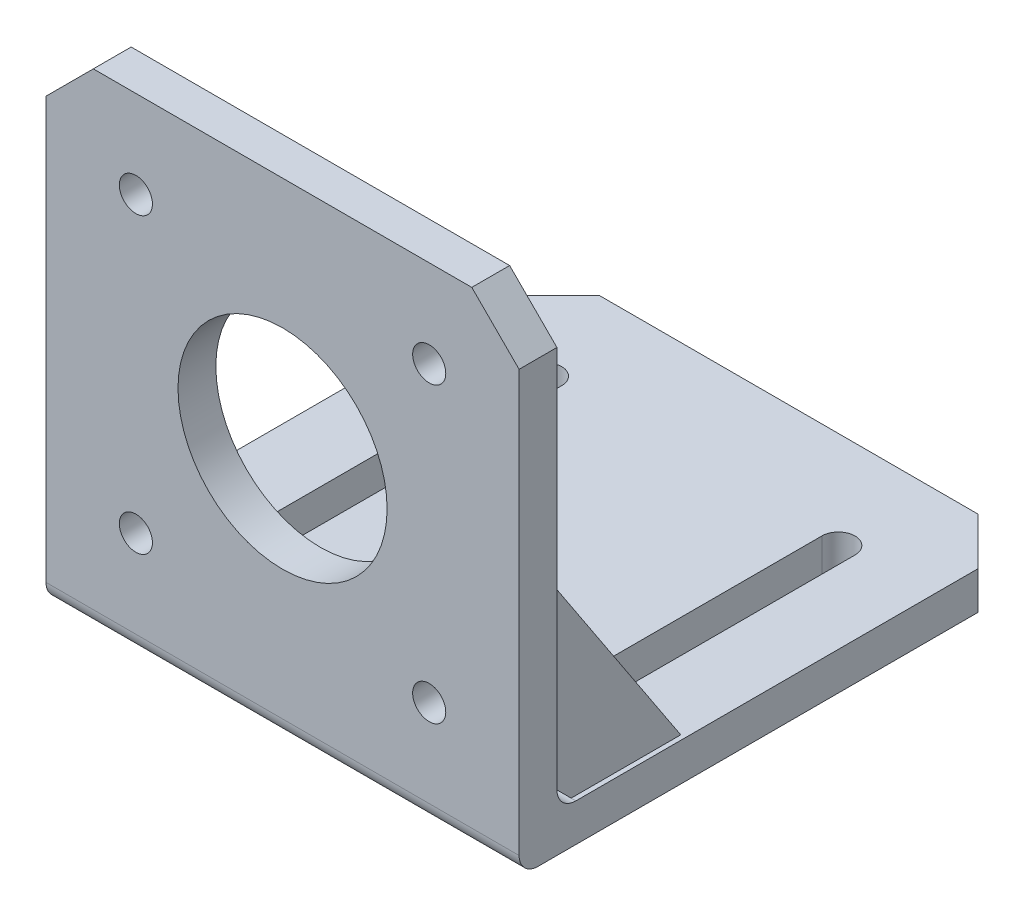
ISO-10303-21;
HEADER;
FILE_DESCRIPTION(('STEP AP214'),'2;1');
FILE_NAME('part.step','',(''),(''),'','','');
FILE_SCHEMA(('AUTOMOTIVE_DESIGN { 1 0 10303 214 1 1 1 1 }'));
ENDSEC;
DATA;
#1=APPLICATION_CONTEXT('core data for automotive mechanical design processes');
#2=APPLICATION_PROTOCOL_DEFINITION('international standard','automotive_design',2000,#1);
#3=PRODUCT_CONTEXT('',#1,'mechanical');
#4=PRODUCT('Part','Part','',(#3));
#5=PRODUCT_RELATED_PRODUCT_CATEGORY('part','',(#4));
#6=PRODUCT_DEFINITION_FORMATION('','',#4);
#7=PRODUCT_DEFINITION_CONTEXT('part definition',#1,'design');
#8=PRODUCT_DEFINITION('design','',#6,#7);
#9=PRODUCT_DEFINITION_SHAPE('','',#8);
#10=(LENGTH_UNIT() NAMED_UNIT(*) SI_UNIT(.MILLI.,.METRE.));
#11=(NAMED_UNIT(*) PLANE_ANGLE_UNIT() SI_UNIT($,.RADIAN.));
#12=(NAMED_UNIT(*) SI_UNIT($,.STERADIAN.) SOLID_ANGLE_UNIT());
#13=UNCERTAINTY_MEASURE_WITH_UNIT(LENGTH_MEASURE(1.E-05),#10,'distance_accuracy_value','');
#14=(GEOMETRIC_REPRESENTATION_CONTEXT(3) GLOBAL_UNCERTAINTY_ASSIGNED_CONTEXT((#13)) GLOBAL_UNIT_ASSIGNED_CONTEXT((#10,
#11,#12)) REPRESENTATION_CONTEXT('',''));
#15=CARTESIAN_POINT('',(0.,0.,0.));
#16=DIRECTION('',(0.,0.,1.));
#17=DIRECTION('',(1.,0.,0.));
#18=AXIS2_PLACEMENT_3D('',#15,#16,#17);
#19=CARTESIAN_POINT('',(50.,4.,-6.00000000000001));
#20=DIRECTION('',(0.,-1.,0.));
#21=DIRECTION('',(0.,0.,-1.));
#22=AXIS2_PLACEMENT_3D('',#19,#20,#21);
#23=PLANE('',#22);
#24=DIRECTION('',(0.,0.,1.));
#25=VECTOR('',#24,1.);
#26=CARTESIAN_POINT('',(11.25,4.,-6.00000000000002));
#27=LINE('',#26,#25);
#28=CARTESIAN_POINT('',(11.25,4.,-43.25));
#29=VERTEX_POINT('',#28);
#30=CARTESIAN_POINT('',(11.25,4.,-12.25));
#31=VERTEX_POINT('',#30);
#32=EDGE_CURVE('E419',#29,#31,#27,.T.);
#33=ORIENTED_EDGE('',*,*,#32,.T.);
#34=CARTESIAN_POINT('',(9.5,4.,-12.25));
#35=DIRECTION('',(0.,-1.,0.));
#36=DIRECTION('',(0.,0.,-1.));
#37=AXIS2_PLACEMENT_3D('',#34,#35,#36);
#38=CIRCLE('',#37,1.75);
#39=CARTESIAN_POINT('',(7.75,4.,-12.25));
#40=VERTEX_POINT('',#39);
#41=EDGE_CURVE('E416',#31,#40,#38,.T.);
#42=ORIENTED_EDGE('',*,*,#41,.T.);
#43=DIRECTION('',(0.,0.,-1.));
#44=VECTOR('',#43,1.);
#45=CARTESIAN_POINT('',(7.75,4.,-6.00000000000002));
#46=LINE('',#45,#44);
#47=CARTESIAN_POINT('',(7.75000000000001,4.,-43.25));
#48=VERTEX_POINT('',#47);
#49=EDGE_CURVE('E425',#40,#48,#46,.T.);
#50=ORIENTED_EDGE('',*,*,#49,.T.);
#51=CARTESIAN_POINT('',(9.50000000000001,4.,-43.25));
#52=DIRECTION('',(0.,-1.,0.));
#53=DIRECTION('',(0.,0.,-1.));
#54=AXIS2_PLACEMENT_3D('',#51,#52,#53);
#55=CIRCLE('',#54,1.75);
#56=EDGE_CURVE('E422',#48,#29,#55,.T.);
#57=ORIENTED_EDGE('',*,*,#56,.T.);
#58=EDGE_LOOP('',(#33,#42,#50,#57));
#59=FACE_BOUND('',#58,.T.);
#60=DIRECTION('',(0.,0.,1.));
#61=VECTOR('',#60,1.);
#62=CARTESIAN_POINT('',(42.25,4.,-6.00000000000001));
#63=LINE('',#62,#61);
#64=CARTESIAN_POINT('',(42.25,4.,-43.25));
#65=VERTEX_POINT('',#64);
#66=CARTESIAN_POINT('',(42.25,4.,-12.25));
#67=VERTEX_POINT('',#66);
#68=EDGE_CURVE('E451',#65,#67,#63,.T.);
#69=ORIENTED_EDGE('',*,*,#68,.T.);
#70=CARTESIAN_POINT('',(40.5,4.,-12.25));
#71=DIRECTION('',(0.,-1.,0.));
#72=DIRECTION('',(0.,0.,-1.));
#73=AXIS2_PLACEMENT_3D('',#70,#71,#72);
#74=CIRCLE('',#73,1.75);
#75=CARTESIAN_POINT('',(38.75,4.,-12.25));
#76=VERTEX_POINT('',#75);
#77=EDGE_CURVE('E448',#67,#76,#74,.T.);
#78=ORIENTED_EDGE('',*,*,#77,.T.);
#79=DIRECTION('',(0.,0.,-1.));
#80=VECTOR('',#79,1.);
#81=CARTESIAN_POINT('',(38.75,4.,-6.00000000000001));
#82=LINE('',#81,#80);
#83=CARTESIAN_POINT('',(38.75,4.,-43.25));
#84=VERTEX_POINT('',#83);
#85=EDGE_CURVE('E457',#76,#84,#82,.T.);
#86=ORIENTED_EDGE('',*,*,#85,.T.);
#87=CARTESIAN_POINT('',(40.5,4.,-43.25));
#88=DIRECTION('',(0.,-1.,0.));
#89=DIRECTION('',(0.,0.,-1.));
#90=AXIS2_PLACEMENT_3D('',#87,#88,#89);
#91=CIRCLE('',#90,1.75);
#92=EDGE_CURVE('E454',#84,#65,#91,.T.);
#93=ORIENTED_EDGE('',*,*,#92,.T.);
#94=EDGE_LOOP('',(#69,#78,#86,#93));
#95=FACE_BOUND('',#94,.T.);
#96=DIRECTION('',(0.,0.,1.));
#97=VECTOR('',#96,1.);
#98=CARTESIAN_POINT('',(2.5,4.,-6.00000000000001));
#99=LINE('',#98,#97);
#100=CARTESIAN_POINT('',(2.5,4.,-17.5857864376269));
#101=VERTEX_POINT('',#100);
#102=CARTESIAN_POINT('',(2.5,4.,-6.00000000000001));
#103=VERTEX_POINT('',#102);
#104=EDGE_CURVE('E230',#101,#103,#99,.T.);
#105=ORIENTED_EDGE('',*,*,#104,.T.);
#106=DIRECTION('',(-1.,0.,0.));
#107=VECTOR('',#106,1.);
#108=CARTESIAN_POINT('',(50.,4.,-6.00000000000001));
#109=LINE('',#108,#107);
#110=CARTESIAN_POINT('',(47.5,4.,-6.00000000000001));
#111=VERTEX_POINT('',#110);
#112=EDGE_CURVE('E239',#111,#103,#109,.T.);
#113=ORIENTED_EDGE('',*,*,#112,.F.);
#114=DIRECTION('',(0.,0.,-1.));
#115=VECTOR('',#114,1.);
#116=CARTESIAN_POINT('',(47.5,4.,-6.00000000000001));
#117=LINE('',#116,#115);
#118=CARTESIAN_POINT('',(47.5,4.,-17.5857864376269));
#119=VERTEX_POINT('',#118);
#120=EDGE_CURVE('E485',#111,#119,#117,.T.);
#121=ORIENTED_EDGE('',*,*,#120,.T.);
#122=DIRECTION('',(1.,0.,0.));
#123=VECTOR('',#122,1.);
#124=CARTESIAN_POINT('',(47.5,4.,-17.5857864376269));
#125=LINE('',#124,#123);
#126=CARTESIAN_POINT('',(49.5,4.,-17.5857864376269));
#127=VERTEX_POINT('',#126);
#128=EDGE_CURVE('E480',#119,#127,#125,.T.);
#129=ORIENTED_EDGE('',*,*,#128,.T.);
#130=DIRECTION('',(0.,0.,-1.));
#131=VECTOR('',#130,1.);
#132=CARTESIAN_POINT('',(49.5,4.,-6.00000000000001));
#133=LINE('',#132,#131);
#134=CARTESIAN_POINT('',(49.5,4.,-6.00000000000001));
#135=VERTEX_POINT('',#134);
#136=EDGE_CURVE('E491',#135,#127,#133,.T.);
#137=ORIENTED_EDGE('',*,*,#136,.F.);
#138=CARTESIAN_POINT('',(50.,4.,-6.00000000000001));
#139=VERTEX_POINT('',#138);
#140=EDGE_CURVE('E248',#139,#135,#109,.T.);
#141=ORIENTED_EDGE('',*,*,#140,.F.);
#142=DIRECTION('',(0.,0.,1.));
#143=VECTOR('',#142,1.);
#144=CARTESIAN_POINT('',(50.,4.,-6.00000000000001));
#145=LINE('',#144,#143);
#146=CARTESIAN_POINT('',(50.,4.,-48.5));
#147=VERTEX_POINT('',#146);
#148=EDGE_CURVE('E331',#147,#139,#145,.T.);
#149=ORIENTED_EDGE('',*,*,#148,.F.);
#150=DIRECTION('',(0.707106781186549,0.,0.707106781186546));
#151=VECTOR('',#150,1.);
#152=CARTESIAN_POINT('',(50.,4.,-48.5));
#153=LINE('',#152,#151);
#154=CARTESIAN_POINT('',(45.,4.,-53.5));
#155=VERTEX_POINT('',#154);
#156=EDGE_CURVE('E263',#147,#155,#153,.F.);
#157=ORIENTED_EDGE('',*,*,#156,.T.);
#158=DIRECTION('',(-1.,0.,0.));
#159=VECTOR('',#158,1.);
#160=CARTESIAN_POINT('',(50.,4.,-53.5));
#161=LINE('',#160,#159);
#162=CARTESIAN_POINT('',(5.,4.,-53.5));
#163=VERTEX_POINT('',#162);
#164=EDGE_CURVE('E251',#155,#163,#161,.T.);
#165=ORIENTED_EDGE('',*,*,#164,.T.);
#166=DIRECTION('',(-0.707106781186547,0.,0.707106781186549));
#167=VECTOR('',#166,1.);
#168=CARTESIAN_POINT('',(4.99999999999999,4.,-53.5));
#169=LINE('',#168,#167);
#170=CARTESIAN_POINT('',(0.,4.,-48.5));
#171=VERTEX_POINT('',#170);
#172=EDGE_CURVE('E265',#163,#171,#169,.T.);
#173=ORIENTED_EDGE('',*,*,#172,.T.);
#174=DIRECTION('',(0.,0.,1.));
#175=VECTOR('',#174,1.);
#176=CARTESIAN_POINT('',(0.,4.,-6.00000000000001));
#177=LINE('',#176,#175);
#178=CARTESIAN_POINT('',(0.,4.,-6.00000000000001));
#179=VERTEX_POINT('',#178);
#180=EDGE_CURVE('E358',#171,#179,#177,.T.);
#181=ORIENTED_EDGE('',*,*,#180,.T.);
#182=CARTESIAN_POINT('',(0.5,4.,-6.00000000000001));
#183=VERTEX_POINT('',#182);
#184=EDGE_CURVE('E249',#183,#179,#109,.T.);
#185=ORIENTED_EDGE('',*,*,#184,.F.);
#186=DIRECTION('',(0.,0.,1.));
#187=VECTOR('',#186,1.);
#188=CARTESIAN_POINT('',(0.5,4.,-6.00000000000001));
#189=LINE('',#188,#187);
#190=CARTESIAN_POINT('',(0.5,4.,-17.5857864376269));
#191=VERTEX_POINT('',#190);
#192=EDGE_CURVE('E47',#191,#183,#189,.T.);
#193=ORIENTED_EDGE('',*,*,#192,.F.);
#194=DIRECTION('',(-1.,0.,0.));
#195=VECTOR('',#194,1.);
#196=CARTESIAN_POINT('',(2.5,4.,-17.5857864376269));
#197=LINE('',#196,#195);
#198=EDGE_CURVE('E241',#101,#191,#197,.T.);
#199=ORIENTED_EDGE('',*,*,#198,.F.);
#200=EDGE_LOOP('',(#105,#113,#121,#129,#137,#141,#149,#157,#165,#173,#181,#185,#193,#199));
#201=FACE_BOUND('',#200,.T.);
#202=ADVANCED_FACE('F32',(#59,#95,#201),#23,.F.);
#203=CARTESIAN_POINT('',(50.,6.00000000000001,-4.));
#204=DIRECTION('',(0.,0.,1.));
#205=DIRECTION('',(1.,0.,0.));
#206=AXIS2_PLACEMENT_3D('',#203,#204,#205);
#207=PLANE('',#206);
#208=CARTESIAN_POINT('',(25.,26.75,-4.));
#209=DIRECTION('',(0.,0.,1.));
#210=DIRECTION('',(1.,0.,0.));
#211=AXIS2_PLACEMENT_3D('',#208,#209,#210);
#212=CIRCLE('',#211,11.05);
#213=CARTESIAN_POINT('',(36.05,26.75,-4.));
#214=VERTEX_POINT('',#213);
#215=EDGE_CURVE('E360',#214,#214,#212,.T.);
#216=ORIENTED_EDGE('',*,*,#215,.T.);
#217=EDGE_LOOP('',(#216));
#218=FACE_BOUND('',#217,.T.);
#219=CARTESIAN_POINT('',(9.5,42.25,-4.));
#220=DIRECTION('',(0.,0.,1.));
#221=DIRECTION('',(1.,0.,0.));
#222=AXIS2_PLACEMENT_3D('',#219,#220,#221);
#223=CIRCLE('',#222,1.75);
#224=CARTESIAN_POINT('',(11.25,42.25,-4.));
#225=VERTEX_POINT('',#224);
#226=EDGE_CURVE('E392',#225,#225,#223,.T.);
#227=ORIENTED_EDGE('',*,*,#226,.T.);
#228=EDGE_LOOP('',(#227));
#229=FACE_BOUND('',#228,.T.);
#230=CARTESIAN_POINT('',(40.5,42.25,-4.));
#231=DIRECTION('',(0.,0.,1.));
#232=DIRECTION('',(1.,0.,0.));
#233=AXIS2_PLACEMENT_3D('',#230,#231,#232);
#234=CIRCLE('',#233,1.75);
#235=CARTESIAN_POINT('',(42.25,42.25,-4.));
#236=VERTEX_POINT('',#235);
#237=EDGE_CURVE('E398',#236,#236,#234,.T.);
#238=ORIENTED_EDGE('',*,*,#237,.T.);
#239=EDGE_LOOP('',(#238));
#240=FACE_BOUND('',#239,.T.);
#241=CARTESIAN_POINT('',(9.50000000000001,11.25,-4.));
#242=DIRECTION('',(0.,0.,1.));
#243=DIRECTION('',(1.,0.,0.));
#244=AXIS2_PLACEMENT_3D('',#241,#242,#243);
#245=CIRCLE('',#244,1.75);
#246=CARTESIAN_POINT('',(11.25,11.25,-4.));
#247=VERTEX_POINT('',#246);
#248=EDGE_CURVE('E404',#247,#247,#245,.T.);
#249=ORIENTED_EDGE('',*,*,#248,.T.);
#250=EDGE_LOOP('',(#249));
#251=FACE_BOUND('',#250,.T.);
#252=CARTESIAN_POINT('',(40.5,11.25,-4.));
#253=DIRECTION('',(0.,0.,1.));
#254=DIRECTION('',(1.,0.,0.));
#255=AXIS2_PLACEMENT_3D('',#252,#253,#254);
#256=CIRCLE('',#255,1.75);
#257=CARTESIAN_POINT('',(42.25,11.25,-4.));
#258=VERTEX_POINT('',#257);
#259=EDGE_CURVE('E410',#258,#258,#256,.T.);
#260=ORIENTED_EDGE('',*,*,#259,.T.);
#261=EDGE_LOOP('',(#260));
#262=FACE_BOUND('',#261,.T.);
#263=DIRECTION('',(0.,1.,0.));
#264=VECTOR('',#263,1.);
#265=CARTESIAN_POINT('',(2.5,24.5857864376269,-4.));
#266=LINE('',#265,#264);
#267=CARTESIAN_POINT('',(2.5,6.00000000000001,-4.));
#268=VERTEX_POINT('',#267);
#269=CARTESIAN_POINT('',(2.5,24.5857864376269,-4.));
#270=VERTEX_POINT('',#269);
#271=EDGE_CURVE('E233',#268,#270,#266,.T.);
#272=ORIENTED_EDGE('',*,*,#271,.T.);
#273=DIRECTION('',(-1.,0.,0.));
#274=VECTOR('',#273,1.);
#275=CARTESIAN_POINT('',(2.5,24.5857864376269,-4.));
#276=LINE('',#275,#274);
#277=CARTESIAN_POINT('',(0.5,24.5857864376269,-4.));
#278=VERTEX_POINT('',#277);
#279=EDGE_CURVE('E513',#270,#278,#276,.T.);
#280=ORIENTED_EDGE('',*,*,#279,.T.);
#281=DIRECTION('',(0.,1.,0.));
#282=VECTOR('',#281,1.);
#283=CARTESIAN_POINT('',(0.5,24.5857864376269,-4.));
#284=LINE('',#283,#282);
#285=CARTESIAN_POINT('',(0.5,6.00000000000001,-4.));
#286=VERTEX_POINT('',#285);
#287=EDGE_CURVE('E518',#286,#278,#284,.T.);
#288=ORIENTED_EDGE('',*,*,#287,.F.);
#289=DIRECTION('',(-1.,0.,0.));
#290=VECTOR('',#289,1.);
#291=CARTESIAN_POINT('',(50.,6.00000000000001,-4.));
#292=LINE('',#291,#290);
#293=CARTESIAN_POINT('',(0.,6.00000000000001,-4.));
#294=VERTEX_POINT('',#293);
#295=EDGE_CURVE('E307',#286,#294,#292,.T.);
#296=ORIENTED_EDGE('',*,*,#295,.T.);
#297=DIRECTION('',(0.,1.,0.));
#298=VECTOR('',#297,1.);
#299=CARTESIAN_POINT('',(0.,6.00000000000001,-4.));
#300=LINE('',#299,#298);
#301=CARTESIAN_POINT('',(0.,46.5,-4.));
#302=VERTEX_POINT('',#301);
#303=EDGE_CURVE('E298',#294,#302,#300,.T.);
#304=ORIENTED_EDGE('',*,*,#303,.T.);
#305=DIRECTION('',(0.707106781186547,0.707106781186549,0.));
#306=VECTOR('',#305,1.);
#307=CARTESIAN_POINT('',(4.99999999999999,51.5,-4.));
#308=LINE('',#307,#306);
#309=CARTESIAN_POINT('',(5.,51.5,-4.));
#310=VERTEX_POINT('',#309);
#311=EDGE_CURVE('E40',#302,#310,#308,.T.);
#312=ORIENTED_EDGE('',*,*,#311,.T.);
#313=DIRECTION('',(-1.,0.,0.));
#314=VECTOR('',#313,1.);
#315=CARTESIAN_POINT('',(50.,51.5,-4.));
#316=LINE('',#315,#314);
#317=CARTESIAN_POINT('',(45.,51.5,-4.));
#318=VERTEX_POINT('',#317);
#319=EDGE_CURVE('E295',#318,#310,#316,.T.);
#320=ORIENTED_EDGE('',*,*,#319,.F.);
#321=DIRECTION('',(-0.707106781186549,0.707106781186546,0.));
#322=VECTOR('',#321,1.);
#323=CARTESIAN_POINT('',(50.,46.5,-4.));
#324=LINE('',#323,#322);
#325=CARTESIAN_POINT('',(50.,46.5,-4.));
#326=VERTEX_POINT('',#325);
#327=EDGE_CURVE('E11',#318,#326,#324,.F.);
#328=ORIENTED_EDGE('',*,*,#327,.T.);
#329=DIRECTION('',(0.,1.,0.));
#330=VECTOR('',#329,1.);
#331=CARTESIAN_POINT('',(50.,6.00000000000001,-4.));
#332=LINE('',#331,#330);
#333=CARTESIAN_POINT('',(50.,6.00000000000001,-4.));
#334=VERTEX_POINT('',#333);
#335=EDGE_CURVE('E348',#334,#326,#332,.T.);
#336=ORIENTED_EDGE('',*,*,#335,.F.);
#337=CARTESIAN_POINT('',(49.5,5.99999999999999,-4.));
#338=VERTEX_POINT('',#337);
#339=EDGE_CURVE('E252',#334,#338,#292,.T.);
#340=ORIENTED_EDGE('',*,*,#339,.T.);
#341=DIRECTION('',(0.,-1.,0.));
#342=VECTOR('',#341,1.);
#343=CARTESIAN_POINT('',(49.5,24.5857864376269,-4.));
#344=LINE('',#343,#342);
#345=CARTESIAN_POINT('',(49.5,24.5857864376269,-4.));
#346=VERTEX_POINT('',#345);
#347=EDGE_CURVE('E498',#346,#338,#344,.T.);
#348=ORIENTED_EDGE('',*,*,#347,.F.);
#349=DIRECTION('',(1.,0.,0.));
#350=VECTOR('',#349,1.);
#351=CARTESIAN_POINT('',(47.5,24.5857864376269,-4.));
#352=LINE('',#351,#350);
#353=CARTESIAN_POINT('',(47.5,24.5857864376269,-4.));
#354=VERTEX_POINT('',#353);
#355=EDGE_CURVE('E481',#354,#346,#352,.T.);
#356=ORIENTED_EDGE('',*,*,#355,.F.);
#357=DIRECTION('',(0.,-1.,0.));
#358=VECTOR('',#357,1.);
#359=CARTESIAN_POINT('',(47.5,24.5857864376269,-4.));
#360=LINE('',#359,#358);
#361=CARTESIAN_POINT('',(47.5,6.00000000000001,-4.));
#362=VERTEX_POINT('',#361);
#363=EDGE_CURVE('E508',#354,#362,#360,.T.);
#364=ORIENTED_EDGE('',*,*,#363,.T.);
#365=EDGE_CURVE('E526',#362,#268,#292,.T.);
#366=ORIENTED_EDGE('',*,*,#365,.T.);
#367=EDGE_LOOP('',(#272,#280,#288,#296,#304,#312,#320,#328,#336,#340,#348,#356,#364,#366));
#368=FACE_BOUND('',#367,.T.);
#369=ADVANCED_FACE('F294',(#218,#229,#240,#251,#262,#368),#207,.F.);
#370=CARTESIAN_POINT('',(50.,0.,-53.5));
#371=DIRECTION('',(0.,0.,1.));
#372=DIRECTION('',(1.,0.,0.));
#373=AXIS2_PLACEMENT_3D('',#370,#371,#372);
#374=PLANE('',#373);
#375=DIRECTION('',(-1.,0.,0.));
#376=VECTOR('',#375,1.);
#377=CARTESIAN_POINT('',(50.,0.,-53.5));
#378=LINE('',#377,#376);
#379=CARTESIAN_POINT('',(45.,0.,-53.5));
#380=VERTEX_POINT('',#379);
#381=CARTESIAN_POINT('',(5.,0.,-53.5));
#382=VERTEX_POINT('',#381);
#383=EDGE_CURVE('E332',#380,#382,#378,.T.);
#384=ORIENTED_EDGE('',*,*,#383,.T.);
#385=DIRECTION('',(0.,1.,0.));
#386=VECTOR('',#385,1.);
#387=CARTESIAN_POINT('',(4.99999999999999,4.,-53.5));
#388=LINE('',#387,#386);
#389=EDGE_CURVE('E260',#382,#163,#388,.T.);
#390=ORIENTED_EDGE('',*,*,#389,.T.);
#391=ORIENTED_EDGE('',*,*,#164,.F.);
#392=DIRECTION('',(0.,-1.,0.));
#393=VECTOR('',#392,1.);
#394=CARTESIAN_POINT('',(45.,0.,-53.5));
#395=LINE('',#394,#393);
#396=EDGE_CURVE('E258',#155,#380,#395,.T.);
#397=ORIENTED_EDGE('',*,*,#396,.T.);
#398=EDGE_LOOP('',(#384,#390,#391,#397));
#399=FACE_BOUND('',#398,.T.);
#400=ADVANCED_FACE('F373',(#399),#374,.F.);
#401=CARTESIAN_POINT('',(50.,6.,-6.));
#402=DIRECTION('',(-1.,0.,0.));
#403=DIRECTION('',(0.,0.,1.));
#404=AXIS2_PLACEMENT_3D('',#401,#402,#403);
#405=CYLINDRICAL_SURFACE('',#404,2.);
#406=CARTESIAN_POINT('',(0.,6.,-6.));
#407=DIRECTION('',(-1.,0.,0.));
#408=DIRECTION('',(0.,0.,1.));
#409=AXIS2_PLACEMENT_3D('',#406,#407,#408);
#410=CIRCLE('',#409,2.);
#411=EDGE_CURVE('E325',#179,#294,#410,.T.);
#412=ORIENTED_EDGE('',*,*,#411,.T.);
#413=ORIENTED_EDGE('',*,*,#295,.F.);
#414=DIRECTION('',(-1.,0.,0.));
#415=VECTOR('',#414,1.);
#416=CARTESIAN_POINT('',(2.5,6.00000000000001,-4.));
#417=LINE('',#416,#415);
#418=EDGE_CURVE('E223',#268,#286,#417,.T.);
#419=ORIENTED_EDGE('',*,*,#418,.F.);
#420=ORIENTED_EDGE('',*,*,#365,.F.);
#421=DIRECTION('',(1.,0.,0.));
#422=VECTOR('',#421,1.);
#423=CARTESIAN_POINT('',(47.5,5.99999999999999,-4.));
#424=LINE('',#423,#422);
#425=EDGE_CURVE('E484',#362,#338,#424,.T.);
#426=ORIENTED_EDGE('',*,*,#425,.T.);
#427=ORIENTED_EDGE('',*,*,#339,.F.);
#428=CARTESIAN_POINT('',(50.,6.,-6.));
#429=DIRECTION('',(-1.,0.,0.));
#430=DIRECTION('',(0.,0.,1.));
#431=AXIS2_PLACEMENT_3D('',#428,#429,#430);
#432=CIRCLE('',#431,2.);
#433=EDGE_CURVE('E352',#139,#334,#432,.T.);
#434=ORIENTED_EDGE('',*,*,#433,.F.);
#435=ORIENTED_EDGE('',*,*,#140,.T.);
#436=DIRECTION('',(1.,0.,0.));
#437=VECTOR('',#436,1.);
#438=CARTESIAN_POINT('',(47.5,4.,-6.00000000000001));
#439=LINE('',#438,#437);
#440=EDGE_CURVE('E247',#111,#135,#439,.T.);
#441=ORIENTED_EDGE('',*,*,#440,.F.);
#442=ORIENTED_EDGE('',*,*,#112,.T.);
#443=DIRECTION('',(-1.,0.,0.));
#444=VECTOR('',#443,1.);
#445=CARTESIAN_POINT('',(2.5,4.,-6.00000000000001));
#446=LINE('',#445,#444);
#447=EDGE_CURVE('E215',#103,#183,#446,.T.);
#448=ORIENTED_EDGE('',*,*,#447,.T.);
#449=ORIENTED_EDGE('',*,*,#184,.T.);
#450=EDGE_LOOP('',(#412,#413,#419,#420,#426,#427,#434,#435,#441,#442,#448,#449));
#451=FACE_BOUND('',#450,.T.);
#452=ADVANCED_FACE('F245',(#451),#405,.F.);
#453=CARTESIAN_POINT('',(50.,51.5,0.));
#454=DIRECTION('',(0.,-1.,0.));
#455=DIRECTION('',(0.,0.,-1.));
#456=AXIS2_PLACEMENT_3D('',#453,#454,#455);
#457=PLANE('',#456);
#458=DIRECTION('',(-1.,0.,0.));
#459=VECTOR('',#458,1.);
#460=CARTESIAN_POINT('',(50.,51.5,0.));
#461=LINE('',#460,#459);
#462=CARTESIAN_POINT('',(45.,51.5,0.));
#463=VERTEX_POINT('',#462);
#464=CARTESIAN_POINT('',(5.,51.5,0.));
#465=VERTEX_POINT('',#464);
#466=EDGE_CURVE('E308',#463,#465,#461,.T.);
#467=ORIENTED_EDGE('',*,*,#466,.F.);
#468=DIRECTION('',(0.,0.,-1.));
#469=VECTOR('',#468,1.);
#470=CARTESIAN_POINT('',(45.,51.5,0.));
#471=LINE('',#470,#469);
#472=EDGE_CURVE('E288',#463,#318,#471,.T.);
#473=ORIENTED_EDGE('',*,*,#472,.T.);
#474=ORIENTED_EDGE('',*,*,#319,.T.);
#475=DIRECTION('',(0.,0.,1.));
#476=VECTOR('',#475,1.);
#477=CARTESIAN_POINT('',(4.99999999999999,51.5,0.));
#478=LINE('',#477,#476);
#479=EDGE_CURVE('E285',#310,#465,#478,.T.);
#480=ORIENTED_EDGE('',*,*,#479,.T.);
#481=EDGE_LOOP('',(#467,#473,#474,#480));
#482=FACE_BOUND('',#481,.T.);
#483=ADVANCED_FACE('F304',(#482),#457,.F.);
#484=CARTESIAN_POINT('',(50.,2.00000000000001,0.));
#485=DIRECTION('',(0.,0.,-1.));
#486=DIRECTION('',(-1.,0.,0.));
#487=AXIS2_PLACEMENT_3D('',#484,#485,#486);
#488=PLANE('',#487);
#489=CARTESIAN_POINT('',(40.5,11.25,0.));
#490=DIRECTION('',(0.,0.,1.));
#491=DIRECTION('',(1.,0.,0.));
#492=AXIS2_PLACEMENT_3D('',#489,#490,#491);
#493=CIRCLE('',#492,1.75);
#494=CARTESIAN_POINT('',(42.25,11.25,0.));
#495=VERTEX_POINT('',#494);
#496=EDGE_CURVE('E413',#495,#495,#493,.T.);
#497=ORIENTED_EDGE('',*,*,#496,.F.);
#498=EDGE_LOOP('',(#497));
#499=FACE_BOUND('',#498,.T.);
#500=CARTESIAN_POINT('',(9.50000000000001,11.25,0.));
#501=DIRECTION('',(0.,0.,1.));
#502=DIRECTION('',(1.,0.,0.));
#503=AXIS2_PLACEMENT_3D('',#500,#501,#502);
#504=CIRCLE('',#503,1.75);
#505=CARTESIAN_POINT('',(11.25,11.25,0.));
#506=VERTEX_POINT('',#505);
#507=EDGE_CURVE('E407',#506,#506,#504,.T.);
#508=ORIENTED_EDGE('',*,*,#507,.F.);
#509=EDGE_LOOP('',(#508));
#510=FACE_BOUND('',#509,.T.);
#511=CARTESIAN_POINT('',(40.5,42.25,0.));
#512=DIRECTION('',(0.,0.,1.));
#513=DIRECTION('',(1.,0.,0.));
#514=AXIS2_PLACEMENT_3D('',#511,#512,#513);
#515=CIRCLE('',#514,1.75);
#516=CARTESIAN_POINT('',(42.25,42.25,0.));
#517=VERTEX_POINT('',#516);
#518=EDGE_CURVE('E401',#517,#517,#515,.T.);
#519=ORIENTED_EDGE('',*,*,#518,.F.);
#520=EDGE_LOOP('',(#519));
#521=FACE_BOUND('',#520,.T.);
#522=CARTESIAN_POINT('',(9.5,42.25,0.));
#523=DIRECTION('',(0.,0.,1.));
#524=DIRECTION('',(1.,0.,0.));
#525=AXIS2_PLACEMENT_3D('',#522,#523,#524);
#526=CIRCLE('',#525,1.75);
#527=CARTESIAN_POINT('',(11.25,42.25,0.));
#528=VERTEX_POINT('',#527);
#529=EDGE_CURVE('E395',#528,#528,#526,.T.);
#530=ORIENTED_EDGE('',*,*,#529,.F.);
#531=EDGE_LOOP('',(#530));
#532=FACE_BOUND('',#531,.T.);
#533=CARTESIAN_POINT('',(25.,26.75,0.));
#534=DIRECTION('',(0.,0.,1.));
#535=DIRECTION('',(1.,0.,0.));
#536=AXIS2_PLACEMENT_3D('',#533,#534,#535);
#537=CIRCLE('',#536,11.05);
#538=CARTESIAN_POINT('',(36.05,26.75,0.));
#539=VERTEX_POINT('',#538);
#540=EDGE_CURVE('E389',#539,#539,#537,.T.);
#541=ORIENTED_EDGE('',*,*,#540,.F.);
#542=EDGE_LOOP('',(#541));
#543=FACE_BOUND('',#542,.T.);
#544=DIRECTION('',(0.,-1.,0.));
#545=VECTOR('',#544,1.);
#546=CARTESIAN_POINT('',(50.,2.00000000000001,0.));
#547=LINE('',#546,#545);
#548=CARTESIAN_POINT('',(50.,46.5,0.));
#549=VERTEX_POINT('',#548);
#550=CARTESIAN_POINT('',(50.,2.00000000000001,0.));
#551=VERTEX_POINT('',#550);
#552=EDGE_CURVE('E346',#549,#551,#547,.T.);
#553=ORIENTED_EDGE('',*,*,#552,.F.);
#554=DIRECTION('',(0.707106781186549,-0.707106781186546,0.));
#555=VECTOR('',#554,1.);
#556=CARTESIAN_POINT('',(50.,46.5,0.));
#557=LINE('',#556,#555);
#558=EDGE_CURVE('E283',#549,#463,#557,.F.);
#559=ORIENTED_EDGE('',*,*,#558,.T.);
#560=ORIENTED_EDGE('',*,*,#466,.T.);
#561=DIRECTION('',(-0.707106781186547,-0.707106781186549,0.));
#562=VECTOR('',#561,1.);
#563=CARTESIAN_POINT('',(4.99999999999999,51.5,0.));
#564=LINE('',#563,#562);
#565=CARTESIAN_POINT('',(0.,46.5,0.));
#566=VERTEX_POINT('',#565);
#567=EDGE_CURVE('E281',#465,#566,#564,.T.);
#568=ORIENTED_EDGE('',*,*,#567,.T.);
#569=DIRECTION('',(0.,-1.,0.));
#570=VECTOR('',#569,1.);
#571=CARTESIAN_POINT('',(0.,2.00000000000001,0.));
#572=LINE('',#571,#570);
#573=CARTESIAN_POINT('',(0.,2.00000000000001,0.));
#574=VERTEX_POINT('',#573);
#575=EDGE_CURVE('E314',#566,#574,#572,.T.);
#576=ORIENTED_EDGE('',*,*,#575,.T.);
#577=DIRECTION('',(-1.,0.,0.));
#578=VECTOR('',#577,1.);
#579=CARTESIAN_POINT('',(50.,2.00000000000001,0.));
#580=LINE('',#579,#578);
#581=EDGE_CURVE('E339',#551,#574,#580,.T.);
#582=ORIENTED_EDGE('',*,*,#581,.F.);
#583=EDGE_LOOP('',(#553,#559,#560,#568,#576,#582));
#584=FACE_BOUND('',#583,.T.);
#585=ADVANCED_FACE('F312',(#499,#510,#521,#532,#543,#584),#488,.F.);
#586=CARTESIAN_POINT('',(50.,2.,-2.));
#587=DIRECTION('',(-1.,0.,0.));
#588=DIRECTION('',(0.,0.,1.));
#589=AXIS2_PLACEMENT_3D('',#586,#587,#588);
#590=CYLINDRICAL_SURFACE('',#589,2.);
#591=CARTESIAN_POINT('',(0.,2.,-2.));
#592=DIRECTION('',(1.,0.,0.));
#593=DIRECTION('',(0.,0.,1.));
#594=AXIS2_PLACEMENT_3D('',#591,#592,#593);
#595=CIRCLE('',#594,2.);
#596=CARTESIAN_POINT('',(0.,0.,-2.00000000000001));
#597=VERTEX_POINT('',#596);
#598=EDGE_CURVE('E321',#574,#597,#595,.T.);
#599=ORIENTED_EDGE('',*,*,#598,.T.);
#600=DIRECTION('',(-1.,0.,0.));
#601=VECTOR('',#600,1.);
#602=CARTESIAN_POINT('',(50.,0.,-2.00000000000001));
#603=LINE('',#602,#601);
#604=CARTESIAN_POINT('',(50.,0.,-2.00000000000001));
#605=VERTEX_POINT('',#604);
#606=EDGE_CURVE('E335',#605,#597,#603,.T.);
#607=ORIENTED_EDGE('',*,*,#606,.F.);
#608=CARTESIAN_POINT('',(50.,2.,-2.));
#609=DIRECTION('',(1.,0.,0.));
#610=DIRECTION('',(0.,0.,1.));
#611=AXIS2_PLACEMENT_3D('',#608,#609,#610);
#612=CIRCLE('',#611,2.);
#613=EDGE_CURVE('E345',#551,#605,#612,.T.);
#614=ORIENTED_EDGE('',*,*,#613,.F.);
#615=ORIENTED_EDGE('',*,*,#581,.T.);
#616=EDGE_LOOP('',(#599,#607,#614,#615));
#617=FACE_BOUND('',#616,.T.);
#618=ADVANCED_FACE('F343',(#617),#590,.T.);
#619=CARTESIAN_POINT('',(50.,0.,-2.00000000000001));
#620=DIRECTION('',(0.,1.,0.));
#621=DIRECTION('',(0.,0.,1.));
#622=AXIS2_PLACEMENT_3D('',#619,#620,#621);
#623=PLANE('',#622);
#624=DIRECTION('',(0.,0.,-1.));
#625=VECTOR('',#624,1.);
#626=CARTESIAN_POINT('',(38.75,0.,-12.25));
#627=LINE('',#626,#625);
#628=CARTESIAN_POINT('',(38.75,0.,-12.25));
#629=VERTEX_POINT('',#628);
#630=CARTESIAN_POINT('',(38.75,0.,-43.25));
#631=VERTEX_POINT('',#630);
#632=EDGE_CURVE('E475',#629,#631,#627,.T.);
#633=ORIENTED_EDGE('',*,*,#632,.F.);
#634=CARTESIAN_POINT('',(40.5,0.,-12.25));
#635=DIRECTION('',(0.,-1.,0.));
#636=DIRECTION('',(0.,0.,-1.));
#637=AXIS2_PLACEMENT_3D('',#634,#635,#636);
#638=CIRCLE('',#637,1.75);
#639=CARTESIAN_POINT('',(42.25,0.,-12.25));
#640=VERTEX_POINT('',#639);
#641=EDGE_CURVE('E478',#640,#629,#638,.T.);
#642=ORIENTED_EDGE('',*,*,#641,.F.);
#643=DIRECTION('',(0.,0.,1.));
#644=VECTOR('',#643,1.);
#645=CARTESIAN_POINT('',(42.25,0.,-12.25));
#646=LINE('',#645,#644);
#647=CARTESIAN_POINT('',(42.25,0.,-43.25));
#648=VERTEX_POINT('',#647);
#649=EDGE_CURVE('E465',#648,#640,#646,.T.);
#650=ORIENTED_EDGE('',*,*,#649,.F.);
#651=CARTESIAN_POINT('',(40.5,0.,-43.25));
#652=DIRECTION('',(0.,-1.,0.));
#653=DIRECTION('',(0.,0.,-1.));
#654=AXIS2_PLACEMENT_3D('',#651,#652,#653);
#655=CIRCLE('',#654,1.75);
#656=EDGE_CURVE('E472',#631,#648,#655,.T.);
#657=ORIENTED_EDGE('',*,*,#656,.F.);
#658=EDGE_LOOP('',(#633,#642,#650,#657));
#659=FACE_BOUND('',#658,.T.);
#660=DIRECTION('',(0.,0.,-1.));
#661=VECTOR('',#660,1.);
#662=CARTESIAN_POINT('',(7.75,0.,-12.25));
#663=LINE('',#662,#661);
#664=CARTESIAN_POINT('',(7.75,0.,-12.25));
#665=VERTEX_POINT('',#664);
#666=CARTESIAN_POINT('',(7.75,0.,-43.25));
#667=VERTEX_POINT('',#666);
#668=EDGE_CURVE('E443',#665,#667,#663,.T.);
#669=ORIENTED_EDGE('',*,*,#668,.F.);
#670=CARTESIAN_POINT('',(9.5,0.,-12.25));
#671=DIRECTION('',(0.,-1.,0.));
#672=DIRECTION('',(0.,0.,-1.));
#673=AXIS2_PLACEMENT_3D('',#670,#671,#672);
#674=CIRCLE('',#673,1.75);
#675=CARTESIAN_POINT('',(11.25,0.,-12.25));
#676=VERTEX_POINT('',#675);
#677=EDGE_CURVE('E446',#676,#665,#674,.T.);
#678=ORIENTED_EDGE('',*,*,#677,.F.);
#679=DIRECTION('',(0.,0.,1.));
#680=VECTOR('',#679,1.);
#681=CARTESIAN_POINT('',(11.25,0.,-12.25));
#682=LINE('',#681,#680);
#683=CARTESIAN_POINT('',(11.25,0.,-43.25));
#684=VERTEX_POINT('',#683);
#685=EDGE_CURVE('E433',#684,#676,#682,.T.);
#686=ORIENTED_EDGE('',*,*,#685,.F.);
#687=CARTESIAN_POINT('',(9.50000000000001,0.,-43.25));
#688=DIRECTION('',(0.,-1.,0.));
#689=DIRECTION('',(0.,0.,-1.));
#690=AXIS2_PLACEMENT_3D('',#687,#688,#689);
#691=CIRCLE('',#690,1.75);
#692=EDGE_CURVE('E440',#667,#684,#691,.T.);
#693=ORIENTED_EDGE('',*,*,#692,.F.);
#694=EDGE_LOOP('',(#669,#678,#686,#693));
#695=FACE_BOUND('',#694,.T.);
#696=DIRECTION('',(0.,0.,-1.));
#697=VECTOR('',#696,1.);
#698=CARTESIAN_POINT('',(0.,0.,-2.00000000000001));
#699=LINE('',#698,#697);
#700=CARTESIAN_POINT('',(0.,0.,-48.5));
#701=VERTEX_POINT('',#700);
#702=EDGE_CURVE('E323',#597,#701,#699,.T.);
#703=ORIENTED_EDGE('',*,*,#702,.T.);
#704=DIRECTION('',(0.707106781186547,0.,-0.707106781186549));
#705=VECTOR('',#704,1.);
#706=CARTESIAN_POINT('',(4.99999999999999,0.,-53.5));
#707=LINE('',#706,#705);
#708=EDGE_CURVE('E273',#701,#382,#707,.T.);
#709=ORIENTED_EDGE('',*,*,#708,.T.);
#710=ORIENTED_EDGE('',*,*,#383,.F.);
#711=DIRECTION('',(-0.707106781186549,0.,-0.707106781186546));
#712=VECTOR('',#711,1.);
#713=CARTESIAN_POINT('',(50.,0.,-48.5));
#714=LINE('',#713,#712);
#715=CARTESIAN_POINT('',(50.,0.,-48.5));
#716=VERTEX_POINT('',#715);
#717=EDGE_CURVE('E271',#380,#716,#714,.F.);
#718=ORIENTED_EDGE('',*,*,#717,.T.);
#719=DIRECTION('',(0.,0.,-1.));
#720=VECTOR('',#719,1.);
#721=CARTESIAN_POINT('',(50.,0.,-2.00000000000001));
#722=LINE('',#721,#720);
#723=EDGE_CURVE('E336',#605,#716,#722,.T.);
#724=ORIENTED_EDGE('',*,*,#723,.F.);
#725=ORIENTED_EDGE('',*,*,#606,.T.);
#726=EDGE_LOOP('',(#703,#709,#710,#718,#724,#725));
#727=FACE_BOUND('',#726,.T.);
#728=ADVANCED_FACE('F370',(#659,#695,#727),#623,.F.);
#729=CARTESIAN_POINT('',(50.,6.,-6.));
#730=DIRECTION('',(-1.,0.,0.));
#731=DIRECTION('',(0.,0.,1.));
#732=AXIS2_PLACEMENT_3D('',#729,#730,#731);
#733=PLANE('',#732);
#734=ORIENTED_EDGE('',*,*,#723,.T.);
#735=DIRECTION('',(0.,1.,0.));
#736=VECTOR('',#735,1.);
#737=CARTESIAN_POINT('',(50.,6.,-48.5));
#738=LINE('',#737,#736);
#739=EDGE_CURVE('E278',#716,#147,#738,.T.);
#740=ORIENTED_EDGE('',*,*,#739,.T.);
#741=ORIENTED_EDGE('',*,*,#148,.T.);
#742=ORIENTED_EDGE('',*,*,#433,.T.);
#743=ORIENTED_EDGE('',*,*,#335,.T.);
#744=DIRECTION('',(0.,0.,1.));
#745=VECTOR('',#744,1.);
#746=CARTESIAN_POINT('',(50.,46.5,-6.));
#747=LINE('',#746,#745);
#748=EDGE_CURVE('E275',#326,#549,#747,.T.);
#749=ORIENTED_EDGE('',*,*,#748,.T.);
#750=ORIENTED_EDGE('',*,*,#552,.T.);
#751=ORIENTED_EDGE('',*,*,#613,.T.);
#752=EDGE_LOOP('',(#734,#740,#741,#742,#743,#749,#750,#751));
#753=FACE_BOUND('',#752,.T.);
#754=ADVANCED_FACE('F380',(#753),#733,.F.);
#755=CARTESIAN_POINT('',(0.,6.,-6.));
#756=DIRECTION('',(-1.,0.,0.));
#757=DIRECTION('',(0.,0.,1.));
#758=AXIS2_PLACEMENT_3D('',#755,#756,#757);
#759=PLANE('',#758);
#760=ORIENTED_EDGE('',*,*,#180,.F.);
#761=DIRECTION('',(0.,-1.,0.));
#762=VECTOR('',#761,1.);
#763=CARTESIAN_POINT('',(0.,0.,-48.5));
#764=LINE('',#763,#762);
#765=EDGE_CURVE('E269',#171,#701,#764,.T.);
#766=ORIENTED_EDGE('',*,*,#765,.T.);
#767=ORIENTED_EDGE('',*,*,#702,.F.);
#768=ORIENTED_EDGE('',*,*,#598,.F.);
#769=ORIENTED_EDGE('',*,*,#575,.F.);
#770=DIRECTION('',(0.,0.,-1.));
#771=VECTOR('',#770,1.);
#772=CARTESIAN_POINT('',(0.,46.5,-4.));
#773=LINE('',#772,#771);
#774=EDGE_CURVE('E267',#566,#302,#773,.T.);
#775=ORIENTED_EDGE('',*,*,#774,.T.);
#776=ORIENTED_EDGE('',*,*,#303,.F.);
#777=ORIENTED_EDGE('',*,*,#411,.F.);
#778=EDGE_LOOP('',(#760,#766,#767,#768,#769,#775,#776,#777));
#779=FACE_BOUND('',#778,.T.);
#780=ADVANCED_FACE('F319',(#779),#759,.T.);
#781=CARTESIAN_POINT('',(25.,26.75,-53.5));
#782=DIRECTION('',(0.,0.,1.));
#783=DIRECTION('',(1.,0.,0.));
#784=AXIS2_PLACEMENT_3D('',#781,#782,#783);
#785=CYLINDRICAL_SURFACE('',#784,11.05);
#786=ORIENTED_EDGE('',*,*,#540,.T.);
#787=EDGE_LOOP('',(#786));
#788=FACE_BOUND('',#787,.T.);
#789=ORIENTED_EDGE('',*,*,#215,.F.);
#790=EDGE_LOOP('',(#789));
#791=FACE_BOUND('',#790,.T.);
#792=ADVANCED_FACE('F634',(#788,#791),#785,.F.);
#793=CARTESIAN_POINT('',(9.5,42.25,-53.5));
#794=DIRECTION('',(0.,0.,1.));
#795=DIRECTION('',(1.,0.,0.));
#796=AXIS2_PLACEMENT_3D('',#793,#794,#795);
#797=CYLINDRICAL_SURFACE('',#796,1.75);
#798=ORIENTED_EDGE('',*,*,#529,.T.);
#799=EDGE_LOOP('',(#798));
#800=FACE_BOUND('',#799,.T.);
#801=ORIENTED_EDGE('',*,*,#226,.F.);
#802=EDGE_LOOP('',(#801));
#803=FACE_BOUND('',#802,.T.);
#804=ADVANCED_FACE('F630',(#800,#803),#797,.F.);
#805=CARTESIAN_POINT('',(40.5,42.25,-53.5));
#806=DIRECTION('',(0.,0.,1.));
#807=DIRECTION('',(1.,0.,0.));
#808=AXIS2_PLACEMENT_3D('',#805,#806,#807);
#809=CYLINDRICAL_SURFACE('',#808,1.75);
#810=ORIENTED_EDGE('',*,*,#518,.T.);
#811=EDGE_LOOP('',(#810));
#812=FACE_BOUND('',#811,.T.);
#813=ORIENTED_EDGE('',*,*,#237,.F.);
#814=EDGE_LOOP('',(#813));
#815=FACE_BOUND('',#814,.T.);
#816=ADVANCED_FACE('F626',(#812,#815),#809,.F.);
#817=CARTESIAN_POINT('',(9.50000000000001,11.25,-53.5));
#818=DIRECTION('',(0.,0.,1.));
#819=DIRECTION('',(1.,0.,0.));
#820=AXIS2_PLACEMENT_3D('',#817,#818,#819);
#821=CYLINDRICAL_SURFACE('',#820,1.75);
#822=ORIENTED_EDGE('',*,*,#507,.T.);
#823=EDGE_LOOP('',(#822));
#824=FACE_BOUND('',#823,.T.);
#825=ORIENTED_EDGE('',*,*,#248,.F.);
#826=EDGE_LOOP('',(#825));
#827=FACE_BOUND('',#826,.T.);
#828=ADVANCED_FACE('F622',(#824,#827),#821,.F.);
#829=CARTESIAN_POINT('',(40.5,11.25,-53.5));
#830=DIRECTION('',(0.,0.,1.));
#831=DIRECTION('',(1.,0.,0.));
#832=AXIS2_PLACEMENT_3D('',#829,#830,#831);
#833=CYLINDRICAL_SURFACE('',#832,1.75);
#834=ORIENTED_EDGE('',*,*,#496,.T.);
#835=EDGE_LOOP('',(#834));
#836=FACE_BOUND('',#835,.T.);
#837=ORIENTED_EDGE('',*,*,#259,.F.);
#838=EDGE_LOOP('',(#837));
#839=FACE_BOUND('',#838,.T.);
#840=ADVANCED_FACE('F618',(#836,#839),#833,.F.);
#841=CARTESIAN_POINT('',(9.5,51.5,-12.25));
#842=DIRECTION('',(0.,-1.,0.));
#843=DIRECTION('',(0.,0.,-1.));
#844=AXIS2_PLACEMENT_3D('',#841,#842,#843);
#845=CYLINDRICAL_SURFACE('',#844,1.75);
#846=DIRECTION('',(0.,-1.,0.));
#847=VECTOR('',#846,1.);
#848=CARTESIAN_POINT('',(11.25,51.5,-12.25));
#849=LINE('',#848,#847);
#850=EDGE_CURVE('E428',#31,#676,#849,.T.);
#851=ORIENTED_EDGE('',*,*,#850,.T.);
#852=ORIENTED_EDGE('',*,*,#677,.T.);
#853=DIRECTION('',(0.,-1.,0.));
#854=VECTOR('',#853,1.);
#855=CARTESIAN_POINT('',(7.75,51.5,-12.25));
#856=LINE('',#855,#854);
#857=EDGE_CURVE('E429',#40,#665,#856,.T.);
#858=ORIENTED_EDGE('',*,*,#857,.F.);
#859=ORIENTED_EDGE('',*,*,#41,.F.);
#860=EDGE_LOOP('',(#851,#852,#858,#859));
#861=FACE_BOUND('',#860,.T.);
#862=ADVANCED_FACE('F608',(#861),#845,.F.);
#863=CARTESIAN_POINT('',(11.25,51.5,-12.25));
#864=DIRECTION('',(1.,0.,0.));
#865=DIRECTION('',(0.,0.,-1.));
#866=AXIS2_PLACEMENT_3D('',#863,#864,#865);
#867=PLANE('',#866);
#868=DIRECTION('',(0.,-1.,0.));
#869=VECTOR('',#868,1.);
#870=CARTESIAN_POINT('',(11.25,51.5,-43.25));
#871=LINE('',#870,#869);
#872=EDGE_CURVE('E435',#29,#684,#871,.T.);
#873=ORIENTED_EDGE('',*,*,#872,.T.);
#874=ORIENTED_EDGE('',*,*,#685,.T.);
#875=ORIENTED_EDGE('',*,*,#850,.F.);
#876=ORIENTED_EDGE('',*,*,#32,.F.);
#877=EDGE_LOOP('',(#873,#874,#875,#876));
#878=FACE_BOUND('',#877,.T.);
#879=ADVANCED_FACE('F604',(#878),#867,.F.);
#880=CARTESIAN_POINT('',(9.50000000000001,51.5,-43.25));
#881=DIRECTION('',(0.,-1.,0.));
#882=DIRECTION('',(0.,0.,-1.));
#883=AXIS2_PLACEMENT_3D('',#880,#881,#882);
#884=CYLINDRICAL_SURFACE('',#883,1.75);
#885=DIRECTION('',(0.,-1.,0.));
#886=VECTOR('',#885,1.);
#887=CARTESIAN_POINT('',(7.75,51.5,-43.25));
#888=LINE('',#887,#886);
#889=EDGE_CURVE('E432',#48,#667,#888,.T.);
#890=ORIENTED_EDGE('',*,*,#889,.T.);
#891=ORIENTED_EDGE('',*,*,#692,.T.);
#892=ORIENTED_EDGE('',*,*,#872,.F.);
#893=ORIENTED_EDGE('',*,*,#56,.F.);
#894=EDGE_LOOP('',(#890,#891,#892,#893));
#895=FACE_BOUND('',#894,.T.);
#896=ADVANCED_FACE('F607',(#895),#884,.F.);
#897=CARTESIAN_POINT('',(7.75,51.5,-12.25));
#898=DIRECTION('',(-1.,0.,0.));
#899=DIRECTION('',(0.,0.,1.));
#900=AXIS2_PLACEMENT_3D('',#897,#898,#899);
#901=PLANE('',#900);
#902=ORIENTED_EDGE('',*,*,#857,.T.);
#903=ORIENTED_EDGE('',*,*,#668,.T.);
#904=ORIENTED_EDGE('',*,*,#889,.F.);
#905=ORIENTED_EDGE('',*,*,#49,.F.);
#906=EDGE_LOOP('',(#902,#903,#904,#905));
#907=FACE_BOUND('',#906,.T.);
#908=ADVANCED_FACE('F602',(#907),#901,.F.);
#909=CARTESIAN_POINT('',(40.5,51.5,-12.25));
#910=DIRECTION('',(0.,-1.,0.));
#911=DIRECTION('',(0.,0.,-1.));
#912=AXIS2_PLACEMENT_3D('',#909,#910,#911);
#913=CYLINDRICAL_SURFACE('',#912,1.75);
#914=DIRECTION('',(0.,-1.,0.));
#915=VECTOR('',#914,1.);
#916=CARTESIAN_POINT('',(42.25,51.5,-12.25));
#917=LINE('',#916,#915);
#918=EDGE_CURVE('E460',#67,#640,#917,.T.);
#919=ORIENTED_EDGE('',*,*,#918,.T.);
#920=ORIENTED_EDGE('',*,*,#641,.T.);
#921=DIRECTION('',(0.,-1.,0.));
#922=VECTOR('',#921,1.);
#923=CARTESIAN_POINT('',(38.75,51.5,-12.25));
#924=LINE('',#923,#922);
#925=EDGE_CURVE('E461',#76,#629,#924,.T.);
#926=ORIENTED_EDGE('',*,*,#925,.F.);
#927=ORIENTED_EDGE('',*,*,#77,.F.);
#928=EDGE_LOOP('',(#919,#920,#926,#927));
#929=FACE_BOUND('',#928,.T.);
#930=ADVANCED_FACE('F592',(#929),#913,.F.);
#931=CARTESIAN_POINT('',(42.25,51.5,-12.25));
#932=DIRECTION('',(1.,0.,0.));
#933=DIRECTION('',(0.,0.,-1.));
#934=AXIS2_PLACEMENT_3D('',#931,#932,#933);
#935=PLANE('',#934);
#936=DIRECTION('',(0.,-1.,0.));
#937=VECTOR('',#936,1.);
#938=CARTESIAN_POINT('',(42.25,51.5,-43.25));
#939=LINE('',#938,#937);
#940=EDGE_CURVE('E467',#65,#648,#939,.T.);
#941=ORIENTED_EDGE('',*,*,#940,.T.);
#942=ORIENTED_EDGE('',*,*,#649,.T.);
#943=ORIENTED_EDGE('',*,*,#918,.F.);
#944=ORIENTED_EDGE('',*,*,#68,.F.);
#945=EDGE_LOOP('',(#941,#942,#943,#944));
#946=FACE_BOUND('',#945,.T.);
#947=ADVANCED_FACE('F588',(#946),#935,.F.);
#948=CARTESIAN_POINT('',(40.5,51.5,-43.25));
#949=DIRECTION('',(0.,-1.,0.));
#950=DIRECTION('',(0.,0.,-1.));
#951=AXIS2_PLACEMENT_3D('',#948,#949,#950);
#952=CYLINDRICAL_SURFACE('',#951,1.75);
#953=DIRECTION('',(0.,-1.,0.));
#954=VECTOR('',#953,1.);
#955=CARTESIAN_POINT('',(38.75,51.5,-43.25));
#956=LINE('',#955,#954);
#957=EDGE_CURVE('E464',#84,#631,#956,.T.);
#958=ORIENTED_EDGE('',*,*,#957,.T.);
#959=ORIENTED_EDGE('',*,*,#656,.T.);
#960=ORIENTED_EDGE('',*,*,#940,.F.);
#961=ORIENTED_EDGE('',*,*,#92,.F.);
#962=EDGE_LOOP('',(#958,#959,#960,#961));
#963=FACE_BOUND('',#962,.T.);
#964=ADVANCED_FACE('F591',(#963),#952,.F.);
#965=CARTESIAN_POINT('',(38.75,51.5,-12.25));
#966=DIRECTION('',(-1.,0.,0.));
#967=DIRECTION('',(0.,0.,1.));
#968=AXIS2_PLACEMENT_3D('',#965,#966,#967);
#969=PLANE('',#968);
#970=ORIENTED_EDGE('',*,*,#925,.T.);
#971=ORIENTED_EDGE('',*,*,#632,.T.);
#972=ORIENTED_EDGE('',*,*,#957,.F.);
#973=ORIENTED_EDGE('',*,*,#85,.F.);
#974=EDGE_LOOP('',(#970,#971,#972,#973));
#975=FACE_BOUND('',#974,.T.);
#976=ADVANCED_FACE('F560',(#975),#969,.F.);
#977=CARTESIAN_POINT('',(4.99999999999999,0.,-53.5));
#978=DIRECTION('',(-0.707106781186548,0.,-0.707106781186546));
#979=DIRECTION('',(0.,-1.,0.));
#980=AXIS2_PLACEMENT_3D('',#977,#978,#979);
#981=PLANE('',#980);
#982=ORIENTED_EDGE('',*,*,#708,.F.);
#983=ORIENTED_EDGE('',*,*,#765,.F.);
#984=ORIENTED_EDGE('',*,*,#172,.F.);
#985=ORIENTED_EDGE('',*,*,#389,.F.);
#986=EDGE_LOOP('',(#982,#983,#984,#985));
#987=FACE_BOUND('',#986,.T.);
#988=ADVANCED_FACE('F366',(#987),#981,.T.);
#989=CARTESIAN_POINT('',(50.,6.,-48.5));
#990=DIRECTION('',(-0.707106781186545,0.,0.707106781186549));
#991=DIRECTION('',(0.,1.,0.));
#992=AXIS2_PLACEMENT_3D('',#989,#990,#991);
#993=PLANE('',#992);
#994=ORIENTED_EDGE('',*,*,#717,.F.);
#995=ORIENTED_EDGE('',*,*,#396,.F.);
#996=ORIENTED_EDGE('',*,*,#156,.F.);
#997=ORIENTED_EDGE('',*,*,#739,.F.);
#998=EDGE_LOOP('',(#994,#995,#996,#997));
#999=FACE_BOUND('',#998,.T.);
#1000=ADVANCED_FACE('F377',(#999),#993,.F.);
#1001=CARTESIAN_POINT('',(50.,46.5,-6.));
#1002=DIRECTION('',(-0.707106781186545,-0.707106781186549,0.));
#1003=DIRECTION('',(0.,0.,1.));
#1004=AXIS2_PLACEMENT_3D('',#1001,#1002,#1003);
#1005=PLANE('',#1004);
#1006=ORIENTED_EDGE('',*,*,#327,.F.);
#1007=ORIENTED_EDGE('',*,*,#472,.F.);
#1008=ORIENTED_EDGE('',*,*,#558,.F.);
#1009=ORIENTED_EDGE('',*,*,#748,.F.);
#1010=EDGE_LOOP('',(#1006,#1007,#1008,#1009));
#1011=FACE_BOUND('',#1010,.T.);
#1012=ADVANCED_FACE('F562',(#1011),#1005,.F.);
#1013=CARTESIAN_POINT('',(4.99999999999999,51.5,0.));
#1014=DIRECTION('',(-0.707106781186548,0.707106781186546,0.));
#1015=DIRECTION('',(0.,0.,-1.));
#1016=AXIS2_PLACEMENT_3D('',#1013,#1014,#1015);
#1017=PLANE('',#1016);
#1018=ORIENTED_EDGE('',*,*,#311,.F.);
#1019=ORIENTED_EDGE('',*,*,#774,.F.);
#1020=ORIENTED_EDGE('',*,*,#567,.F.);
#1021=ORIENTED_EDGE('',*,*,#479,.F.);
#1022=EDGE_LOOP('',(#1018,#1019,#1020,#1021));
#1023=FACE_BOUND('',#1022,.T.);
#1024=ADVANCED_FACE('F34',(#1023),#1017,.T.);
#1025=CARTESIAN_POINT('',(47.5,4.,-17.5857864376269));
#1026=DIRECTION('',(0.,0.550818693777714,-0.834624925691183));
#1027=DIRECTION('',(0.,0.834624925691183,0.550818693777714));
#1028=AXIS2_PLACEMENT_3D('',#1025,#1026,#1027);
#1029=PLANE('',#1028);
#1030=DIRECTION('',(0.,0.834624925691183,0.550818693777714));
#1031=VECTOR('',#1030,1.);
#1032=CARTESIAN_POINT('',(49.5,4.,-17.5857864376269));
#1033=LINE('',#1032,#1031);
#1034=EDGE_CURVE('E501',#127,#346,#1033,.T.);
#1035=ORIENTED_EDGE('',*,*,#1034,.F.);
#1036=ORIENTED_EDGE('',*,*,#128,.F.);
#1037=DIRECTION('',(0.,0.834624925691183,0.550818693777714));
#1038=VECTOR('',#1037,1.);
#1039=CARTESIAN_POINT('',(47.5,4.,-17.5857864376269));
#1040=LINE('',#1039,#1038);
#1041=EDGE_CURVE('E494',#119,#354,#1040,.T.);
#1042=ORIENTED_EDGE('',*,*,#1041,.T.);
#1043=ORIENTED_EDGE('',*,*,#355,.T.);
#1044=EDGE_LOOP('',(#1035,#1036,#1042,#1043));
#1045=FACE_BOUND('',#1044,.T.);
#1046=ADVANCED_FACE('F568',(#1045),#1029,.T.);
#1047=CARTESIAN_POINT('',(47.5,5.99999999999999,-4.));
#1048=DIRECTION('',(0.,-0.707106781186552,0.707106781186543));
#1049=DIRECTION('',(0.,-0.707106781186543,-0.707106781186552));
#1050=AXIS2_PLACEMENT_3D('',#1047,#1048,#1049);
#1051=PLANE('',#1050);
#1052=DIRECTION('',(0.,-0.707106781186543,-0.707106781186552));
#1053=VECTOR('',#1052,1.);
#1054=CARTESIAN_POINT('',(49.5,5.99999999999999,-4.));
#1055=LINE('',#1054,#1053);
#1056=EDGE_CURVE('E495',#338,#135,#1055,.T.);
#1057=ORIENTED_EDGE('',*,*,#1056,.F.);
#1058=ORIENTED_EDGE('',*,*,#425,.F.);
#1059=DIRECTION('',(0.,-0.707106781186543,-0.707106781186552));
#1060=VECTOR('',#1059,1.);
#1061=CARTESIAN_POINT('',(47.5,5.99999999999999,-4.));
#1062=LINE('',#1061,#1060);
#1063=EDGE_CURVE('E505',#362,#111,#1062,.T.);
#1064=ORIENTED_EDGE('',*,*,#1063,.T.);
#1065=ORIENTED_EDGE('',*,*,#440,.T.);
#1066=EDGE_LOOP('',(#1057,#1058,#1064,#1065));
#1067=FACE_BOUND('',#1066,.T.);
#1068=ADVANCED_FACE('F578',(#1067),#1051,.T.);
#1069=CARTESIAN_POINT('',(47.5,0.,0.));
#1070=DIRECTION('',(-1.,0.,0.));
#1071=DIRECTION('',(0.,0.,1.));
#1072=AXIS2_PLACEMENT_3D('',#1069,#1070,#1071);
#1073=PLANE('',#1072);
#1074=ORIENTED_EDGE('',*,*,#1041,.F.);
#1075=ORIENTED_EDGE('',*,*,#120,.F.);
#1076=ORIENTED_EDGE('',*,*,#1063,.F.);
#1077=ORIENTED_EDGE('',*,*,#363,.F.);
#1078=EDGE_LOOP('',(#1074,#1075,#1076,#1077));
#1079=FACE_BOUND('',#1078,.T.);
#1080=ADVANCED_FACE('F541',(#1079),#1073,.T.);
#1081=CARTESIAN_POINT('',(49.5,0.,0.));
#1082=DIRECTION('',(-1.,0.,0.));
#1083=DIRECTION('',(0.,0.,1.));
#1084=AXIS2_PLACEMENT_3D('',#1081,#1082,#1083);
#1085=PLANE('',#1084);
#1086=ORIENTED_EDGE('',*,*,#1034,.T.);
#1087=ORIENTED_EDGE('',*,*,#347,.T.);
#1088=ORIENTED_EDGE('',*,*,#1056,.T.);
#1089=ORIENTED_EDGE('',*,*,#136,.T.);
#1090=EDGE_LOOP('',(#1086,#1087,#1088,#1089));
#1091=FACE_BOUND('',#1090,.T.);
#1092=ADVANCED_FACE('F534',(#1091),#1085,.F.);
#1093=CARTESIAN_POINT('',(2.5,4.,-17.5857864376269));
#1094=DIRECTION('',(0.,0.550818693777714,-0.834624925691183));
#1095=DIRECTION('',(0.,0.834624925691183,0.550818693777714));
#1096=AXIS2_PLACEMENT_3D('',#1093,#1094,#1095);
#1097=PLANE('',#1096);
#1098=DIRECTION('',(0.,-0.834624925691183,-0.550818693777714));
#1099=VECTOR('',#1098,1.);
#1100=CARTESIAN_POINT('',(0.5,4.,-17.5857864376269));
#1101=LINE('',#1100,#1099);
#1102=EDGE_CURVE('E242',#278,#191,#1101,.T.);
#1103=ORIENTED_EDGE('',*,*,#1102,.F.);
#1104=ORIENTED_EDGE('',*,*,#279,.F.);
#1105=DIRECTION('',(0.,-0.834624925691183,-0.550818693777714));
#1106=VECTOR('',#1105,1.);
#1107=CARTESIAN_POINT('',(2.5,4.,-17.5857864376269));
#1108=LINE('',#1107,#1106);
#1109=EDGE_CURVE('E224',#270,#101,#1108,.T.);
#1110=ORIENTED_EDGE('',*,*,#1109,.T.);
#1111=ORIENTED_EDGE('',*,*,#198,.T.);
#1112=EDGE_LOOP('',(#1103,#1104,#1110,#1111));
#1113=FACE_BOUND('',#1112,.T.);
#1114=ADVANCED_FACE('F532',(#1113),#1097,.T.);
#1115=CARTESIAN_POINT('',(2.5,6.00000000000001,-4.));
#1116=DIRECTION('',(0.,-0.707106781186547,0.707106781186547));
#1117=DIRECTION('',(0.,-0.707106781186548,-0.707106781186548));
#1118=AXIS2_PLACEMENT_3D('',#1115,#1116,#1117);
#1119=PLANE('',#1118);
#1120=DIRECTION('',(0.,0.707106781186547,0.707106781186547));
#1121=VECTOR('',#1120,1.);
#1122=CARTESIAN_POINT('',(0.5,6.00000000000001,-4.));
#1123=LINE('',#1122,#1121);
#1124=EDGE_CURVE('E51',#183,#286,#1123,.T.);
#1125=ORIENTED_EDGE('',*,*,#1124,.F.);
#1126=ORIENTED_EDGE('',*,*,#447,.F.);
#1127=DIRECTION('',(0.,0.707106781186547,0.707106781186547));
#1128=VECTOR('',#1127,1.);
#1129=CARTESIAN_POINT('',(2.5,6.00000000000001,-4.));
#1130=LINE('',#1129,#1128);
#1131=EDGE_CURVE('E218',#103,#268,#1130,.T.);
#1132=ORIENTED_EDGE('',*,*,#1131,.T.);
#1133=ORIENTED_EDGE('',*,*,#418,.T.);
#1134=EDGE_LOOP('',(#1125,#1126,#1132,#1133));
#1135=FACE_BOUND('',#1134,.T.);
#1136=ADVANCED_FACE('F217',(#1135),#1119,.T.);
#1137=CARTESIAN_POINT('',(2.5,0.,0.));
#1138=DIRECTION('',(-1.,0.,0.));
#1139=DIRECTION('',(0.,0.,1.));
#1140=AXIS2_PLACEMENT_3D('',#1137,#1138,#1139);
#1141=PLANE('',#1140);
#1142=ORIENTED_EDGE('',*,*,#104,.F.);
#1143=ORIENTED_EDGE('',*,*,#1109,.F.);
#1144=ORIENTED_EDGE('',*,*,#271,.F.);
#1145=ORIENTED_EDGE('',*,*,#1131,.F.);
#1146=EDGE_LOOP('',(#1142,#1143,#1144,#1145));
#1147=FACE_BOUND('',#1146,.T.);
#1148=ADVANCED_FACE('F228',(#1147),#1141,.F.);
#1149=CARTESIAN_POINT('',(0.5,0.,0.));
#1150=DIRECTION('',(-1.,0.,0.));
#1151=DIRECTION('',(0.,0.,1.));
#1152=AXIS2_PLACEMENT_3D('',#1149,#1150,#1151);
#1153=PLANE('',#1152);
#1154=ORIENTED_EDGE('',*,*,#192,.T.);
#1155=ORIENTED_EDGE('',*,*,#1124,.T.);
#1156=ORIENTED_EDGE('',*,*,#287,.T.);
#1157=ORIENTED_EDGE('',*,*,#1102,.T.);
#1158=EDGE_LOOP('',(#1154,#1155,#1156,#1157));
#1159=FACE_BOUND('',#1158,.T.);
#1160=ADVANCED_FACE('F530',(#1159),#1153,.T.);
#1161=CLOSED_SHELL('',(#202,#369,#400,#452,#483,#585,#618,#728,#754,#780,#792,#804,#816,#828,
#840,#862,#879,#896,#908,#930,#947,#964,#976,#988,#1000,#1012,#1024,#1046,#1068,#1080,#1092,
#1114,#1136,#1148,#1160));
#1162=MANIFOLD_SOLID_BREP('B2',#1161);
#1163=ADVANCED_BREP_SHAPE_REPRESENTATION('',(#18,#1162),#14);
#1164=SHAPE_DEFINITION_REPRESENTATION(#9,#1163);
ENDSEC;
END-ISO-10303-21;
